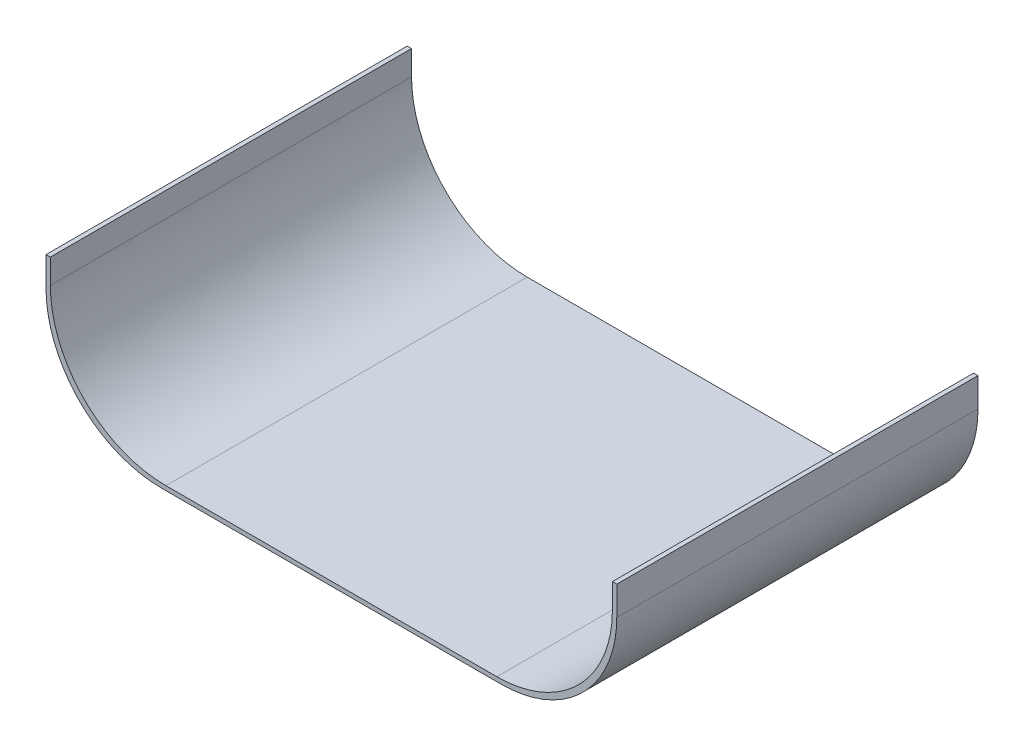
ISO-10303-21;
HEADER;
FILE_DESCRIPTION(('STEP AP214'),'2;1');
FILE_NAME('part.step','',(''),(''),'','','');
FILE_SCHEMA(('AUTOMOTIVE_DESIGN { 1 0 10303 214 1 1 1 1 }'));
ENDSEC;
DATA;
#1=APPLICATION_CONTEXT('core data for automotive mechanical design processes');
#2=APPLICATION_PROTOCOL_DEFINITION('international standard','automotive_design',2000,#1);
#3=PRODUCT_CONTEXT('',#1,'mechanical');
#4=PRODUCT('Part','Part','',(#3));
#5=PRODUCT_RELATED_PRODUCT_CATEGORY('part','',(#4));
#6=PRODUCT_DEFINITION_FORMATION('','',#4);
#7=PRODUCT_DEFINITION_CONTEXT('part definition',#1,'design');
#8=PRODUCT_DEFINITION('design','',#6,#7);
#9=PRODUCT_DEFINITION_SHAPE('','',#8);
#10=(LENGTH_UNIT() NAMED_UNIT(*) SI_UNIT(.MILLI.,.METRE.));
#11=(NAMED_UNIT(*) PLANE_ANGLE_UNIT() SI_UNIT($,.RADIAN.));
#12=(NAMED_UNIT(*) SI_UNIT($,.STERADIAN.) SOLID_ANGLE_UNIT());
#13=UNCERTAINTY_MEASURE_WITH_UNIT(LENGTH_MEASURE(1.E-05),#10,'distance_accuracy_value','');
#14=(GEOMETRIC_REPRESENTATION_CONTEXT(3) GLOBAL_UNCERTAINTY_ASSIGNED_CONTEXT((#13)) GLOBAL_UNIT_ASSIGNED_CONTEXT((#10,
#11,#12)) REPRESENTATION_CONTEXT('',''));
#15=CARTESIAN_POINT('',(0.,0.,0.));
#16=DIRECTION('',(0.,0.,1.));
#17=DIRECTION('',(1.,0.,0.));
#18=AXIS2_PLACEMENT_3D('',#15,#16,#17);
#19=CARTESIAN_POINT('',(83.,-17.,0.));
#20=DIRECTION('',(0.,0.,-1.));
#21=DIRECTION('',(-1.,0.,0.));
#22=AXIS2_PLACEMENT_3D('',#19,#20,#21);
#23=PLANE('',#22);
#24=DIRECTION('',(-1.,0.,0.));
#25=VECTOR('',#24,1.);
#26=CARTESIAN_POINT('',(0.,0.,0.));
#27=LINE('',#26,#25);
#28=CARTESIAN_POINT('',(3.,0.,0.));
#29=VERTEX_POINT('',#28);
#30=CARTESIAN_POINT('',(0.,0.,0.));
#31=VERTEX_POINT('',#30);
#32=EDGE_CURVE('E209',#29,#31,#27,.T.);
#33=ORIENTED_EDGE('',*,*,#32,.T.);
#34=DIRECTION('',(0.,-1.,0.));
#35=VECTOR('',#34,1.);
#36=CARTESIAN_POINT('',(0.,0.,0.));
#37=LINE('',#36,#35);
#38=CARTESIAN_POINT('',(0.,-19.9999999999994,0.));
#39=VERTEX_POINT('',#38);
#40=EDGE_CURVE('E219',#31,#39,#37,.T.);
#41=ORIENTED_EDGE('',*,*,#40,.T.);
#42=CARTESIAN_POINT('',(80.,-20.,0.));
#43=DIRECTION('',(0.,0.,1.));
#44=DIRECTION('',(-1.,0.,0.));
#45=AXIS2_PLACEMENT_3D('',#42,#43,#44);
#46=CIRCLE('',#45,80.);
#47=CARTESIAN_POINT('',(80.0000000000006,-100.,0.));
#48=VERTEX_POINT('',#47);
#49=EDGE_CURVE('E230',#39,#48,#46,.T.);
#50=ORIENTED_EDGE('',*,*,#49,.T.);
#51=DIRECTION('',(1.,0.,0.));
#52=VECTOR('',#51,1.);
#53=CARTESIAN_POINT('',(80.0000000000006,-100.,0.));
#54=LINE('',#53,#52);
#55=CARTESIAN_POINT('',(314.999999999999,-100.,0.));
#56=VERTEX_POINT('',#55);
#57=EDGE_CURVE('E87',#48,#56,#54,.T.);
#58=ORIENTED_EDGE('',*,*,#57,.T.);
#59=CARTESIAN_POINT('',(315.,-20.,0.));
#60=DIRECTION('',(0.,0.,1.));
#61=DIRECTION('',(-1.,0.,0.));
#62=AXIS2_PLACEMENT_3D('',#59,#60,#61);
#63=CIRCLE('',#62,80.);
#64=CARTESIAN_POINT('',(395.,-19.9999999999994,0.));
#65=VERTEX_POINT('',#64);
#66=EDGE_CURVE('E82',#56,#65,#63,.T.);
#67=ORIENTED_EDGE('',*,*,#66,.T.);
#68=DIRECTION('',(0.,1.,0.));
#69=VECTOR('',#68,1.);
#70=CARTESIAN_POINT('',(395.,-19.9999999999994,0.));
#71=LINE('',#70,#69);
#72=CARTESIAN_POINT('',(395.,0.,0.));
#73=VERTEX_POINT('',#72);
#74=EDGE_CURVE('E76',#65,#73,#71,.T.);
#75=ORIENTED_EDGE('',*,*,#74,.T.);
#76=DIRECTION('',(-1.,0.,0.));
#77=VECTOR('',#76,1.);
#78=CARTESIAN_POINT('',(392.,0.,0.));
#79=LINE('',#78,#77);
#80=CARTESIAN_POINT('',(392.,0.,0.));
#81=VERTEX_POINT('',#80);
#82=EDGE_CURVE('E141',#73,#81,#79,.T.);
#83=ORIENTED_EDGE('',*,*,#82,.T.);
#84=DIRECTION('',(0.,-1.,0.));
#85=VECTOR('',#84,1.);
#86=CARTESIAN_POINT('',(392.,-17.,0.));
#87=LINE('',#86,#85);
#88=CARTESIAN_POINT('',(392.,-17.,0.));
#89=VERTEX_POINT('',#88);
#90=EDGE_CURVE('E149',#81,#89,#87,.T.);
#91=ORIENTED_EDGE('',*,*,#90,.T.);
#92=CARTESIAN_POINT('',(312.,-17.,0.));
#93=DIRECTION('',(0.,0.,-1.));
#94=DIRECTION('',(-1.,0.,0.));
#95=AXIS2_PLACEMENT_3D('',#92,#93,#94);
#96=CIRCLE('',#95,80.);
#97=CARTESIAN_POINT('',(312.,-97.,0.));
#98=VERTEX_POINT('',#97);
#99=EDGE_CURVE('E164',#89,#98,#96,.T.);
#100=ORIENTED_EDGE('',*,*,#99,.T.);
#101=DIRECTION('',(-1.,0.,0.));
#102=VECTOR('',#101,1.);
#103=CARTESIAN_POINT('',(83.,-97.,0.));
#104=LINE('',#103,#102);
#105=CARTESIAN_POINT('',(83.,-97.,0.));
#106=VERTEX_POINT('',#105);
#107=EDGE_CURVE('E176',#98,#106,#104,.T.);
#108=ORIENTED_EDGE('',*,*,#107,.T.);
#109=CARTESIAN_POINT('',(83.,-17.,0.));
#110=DIRECTION('',(0.,0.,-1.));
#111=DIRECTION('',(-1.,0.,0.));
#112=AXIS2_PLACEMENT_3D('',#109,#110,#111);
#113=CIRCLE('',#112,80.);
#114=CARTESIAN_POINT('',(3.,-17.,0.));
#115=VERTEX_POINT('',#114);
#116=EDGE_CURVE('E187',#106,#115,#113,.T.);
#117=ORIENTED_EDGE('',*,*,#116,.T.);
#118=DIRECTION('',(0.,1.,0.));
#119=VECTOR('',#118,1.);
#120=CARTESIAN_POINT('',(3.,0.,0.));
#121=LINE('',#120,#119);
#122=EDGE_CURVE('E198',#115,#29,#121,.T.);
#123=ORIENTED_EDGE('',*,*,#122,.T.);
#124=EDGE_LOOP('',(#33,#41,#50,#58,#67,#75,#83,#91,#100,#108,#117,#123));
#125=FACE_BOUND('',#124,.T.);
#126=ADVANCED_FACE('F39',(#125),#23,.F.);
#127=CARTESIAN_POINT('',(82.9999999999999,-17.,-250.));
#128=DIRECTION('',(0.,0.,-1.));
#129=DIRECTION('',(-1.,0.,0.));
#130=AXIS2_PLACEMENT_3D('',#127,#128,#129);
#131=PLANE('',#130);
#132=DIRECTION('',(-1.,0.,0.));
#133=VECTOR('',#132,1.);
#134=CARTESIAN_POINT('',(0.,0.,-250.));
#135=LINE('',#134,#133);
#136=CARTESIAN_POINT('',(2.99999999999992,0.,-250.));
#137=VERTEX_POINT('',#136);
#138=CARTESIAN_POINT('',(0.,0.,-250.));
#139=VERTEX_POINT('',#138);
#140=EDGE_CURVE('E216',#137,#139,#135,.T.);
#141=ORIENTED_EDGE('',*,*,#140,.F.);
#142=DIRECTION('',(0.,1.,0.));
#143=VECTOR('',#142,1.);
#144=CARTESIAN_POINT('',(2.99999999999992,0.,-250.));
#145=LINE('',#144,#143);
#146=CARTESIAN_POINT('',(2.99999999999992,-17.,-250.));
#147=VERTEX_POINT('',#146);
#148=EDGE_CURVE('E205',#147,#137,#145,.T.);
#149=ORIENTED_EDGE('',*,*,#148,.F.);
#150=CARTESIAN_POINT('',(82.9999999999999,-17.,-250.));
#151=DIRECTION('',(0.,0.,-1.));
#152=DIRECTION('',(-1.,0.,0.));
#153=AXIS2_PLACEMENT_3D('',#150,#151,#152);
#154=CIRCLE('',#153,80.);
#155=CARTESIAN_POINT('',(82.9999999999999,-97.,-250.));
#156=VERTEX_POINT('',#155);
#157=EDGE_CURVE('E194',#156,#147,#154,.T.);
#158=ORIENTED_EDGE('',*,*,#157,.F.);
#159=DIRECTION('',(-1.,0.,0.));
#160=VECTOR('',#159,1.);
#161=CARTESIAN_POINT('',(82.9999999999999,-97.,-250.));
#162=LINE('',#161,#160);
#163=CARTESIAN_POINT('',(312.,-97.,-250.));
#164=VERTEX_POINT('',#163);
#165=EDGE_CURVE('E183',#164,#156,#162,.T.);
#166=ORIENTED_EDGE('',*,*,#165,.F.);
#167=CARTESIAN_POINT('',(312.,-17.,-250.));
#168=DIRECTION('',(0.,0.,-1.));
#169=DIRECTION('',(-1.,0.,0.));
#170=AXIS2_PLACEMENT_3D('',#167,#168,#169);
#171=CIRCLE('',#170,80.);
#172=CARTESIAN_POINT('',(392.,-17.,-250.));
#173=VERTEX_POINT('',#172);
#174=EDGE_CURVE('E172',#173,#164,#171,.T.);
#175=ORIENTED_EDGE('',*,*,#174,.F.);
#176=DIRECTION('',(0.,-1.,0.));
#177=VECTOR('',#176,1.);
#178=CARTESIAN_POINT('',(392.,-17.,-250.));
#179=LINE('',#178,#177);
#180=CARTESIAN_POINT('',(392.,0.,-250.));
#181=VERTEX_POINT('',#180);
#182=EDGE_CURVE('E165',#181,#173,#179,.T.);
#183=ORIENTED_EDGE('',*,*,#182,.F.);
#184=DIRECTION('',(-1.,0.,0.));
#185=VECTOR('',#184,1.);
#186=CARTESIAN_POINT('',(392.,0.,-250.));
#187=LINE('',#186,#185);
#188=CARTESIAN_POINT('',(395.,0.,-250.));
#189=VERTEX_POINT('',#188);
#190=EDGE_CURVE('E156',#189,#181,#187,.T.);
#191=ORIENTED_EDGE('',*,*,#190,.F.);
#192=DIRECTION('',(0.,1.,0.));
#193=VECTOR('',#192,1.);
#194=CARTESIAN_POINT('',(395.,-19.9999999999994,-250.));
#195=LINE('',#194,#193);
#196=CARTESIAN_POINT('',(395.,-19.9999999999994,-250.));
#197=VERTEX_POINT('',#196);
#198=EDGE_CURVE('E11',#197,#189,#195,.T.);
#199=ORIENTED_EDGE('',*,*,#198,.F.);
#200=CARTESIAN_POINT('',(315.,-20.,-250.));
#201=DIRECTION('',(0.,0.,1.));
#202=DIRECTION('',(-1.,0.,0.));
#203=AXIS2_PLACEMENT_3D('',#200,#201,#202);
#204=CIRCLE('',#203,80.);
#205=CARTESIAN_POINT('',(314.999999999999,-100.,-250.));
#206=VERTEX_POINT('',#205);
#207=EDGE_CURVE('E54',#206,#197,#204,.T.);
#208=ORIENTED_EDGE('',*,*,#207,.F.);
#209=DIRECTION('',(1.,0.,0.));
#210=VECTOR('',#209,1.);
#211=CARTESIAN_POINT('',(80.0000000000005,-100.,-250.));
#212=LINE('',#211,#210);
#213=CARTESIAN_POINT('',(80.0000000000005,-100.,-250.));
#214=VERTEX_POINT('',#213);
#215=EDGE_CURVE('E63',#214,#206,#212,.T.);
#216=ORIENTED_EDGE('',*,*,#215,.F.);
#217=CARTESIAN_POINT('',(79.9999999999999,-20.,-250.));
#218=DIRECTION('',(0.,0.,1.));
#219=DIRECTION('',(-1.,0.,0.));
#220=AXIS2_PLACEMENT_3D('',#217,#218,#219);
#221=CIRCLE('',#220,80.);
#222=CARTESIAN_POINT('',(0.,-19.9999999999994,-250.));
#223=VERTEX_POINT('',#222);
#224=EDGE_CURVE('E237',#223,#214,#221,.T.);
#225=ORIENTED_EDGE('',*,*,#224,.F.);
#226=DIRECTION('',(0.,-1.,0.));
#227=VECTOR('',#226,1.);
#228=CARTESIAN_POINT('',(0.,0.,-250.));
#229=LINE('',#228,#227);
#230=EDGE_CURVE('E226',#139,#223,#229,.T.);
#231=ORIENTED_EDGE('',*,*,#230,.F.);
#232=EDGE_LOOP('',(#141,#149,#158,#166,#175,#183,#191,#199,#208,#216,#225,#231));
#233=FACE_BOUND('',#232,.T.);
#234=ADVANCED_FACE('F269',(#233),#131,.T.);
#235=CARTESIAN_POINT('',(392.,0.,0.));
#236=DIRECTION('',(0.,-1.,0.));
#237=DIRECTION('',(0.,0.,-1.));
#238=AXIS2_PLACEMENT_3D('',#235,#236,#237);
#239=PLANE('',#238);
#240=DIRECTION('',(0.,0.,-1.));
#241=VECTOR('',#240,1.);
#242=CARTESIAN_POINT('',(392.,0.,0.));
#243=LINE('',#242,#241);
#244=EDGE_CURVE('E145',#81,#181,#243,.T.);
#245=ORIENTED_EDGE('',*,*,#244,.F.);
#246=ORIENTED_EDGE('',*,*,#82,.F.);
#247=DIRECTION('',(0.,0.,-1.));
#248=VECTOR('',#247,1.);
#249=CARTESIAN_POINT('',(395.,0.,0.));
#250=LINE('',#249,#248);
#251=EDGE_CURVE('E143',#73,#189,#250,.T.);
#252=ORIENTED_EDGE('',*,*,#251,.T.);
#253=ORIENTED_EDGE('',*,*,#190,.T.);
#254=EDGE_LOOP('',(#245,#246,#252,#253));
#255=FACE_BOUND('',#254,.T.);
#256=ADVANCED_FACE('F142',(#255),#239,.F.);
#257=CARTESIAN_POINT('',(392.,-17.,0.));
#258=DIRECTION('',(1.,0.,0.));
#259=DIRECTION('',(0.,0.,-1.));
#260=AXIS2_PLACEMENT_3D('',#257,#258,#259);
#261=PLANE('',#260);
#262=DIRECTION('',(0.,0.,-1.));
#263=VECTOR('',#262,1.);
#264=CARTESIAN_POINT('',(392.,-17.,0.));
#265=LINE('',#264,#263);
#266=EDGE_CURVE('E168',#89,#173,#265,.T.);
#267=ORIENTED_EDGE('',*,*,#266,.F.);
#268=ORIENTED_EDGE('',*,*,#90,.F.);
#269=ORIENTED_EDGE('',*,*,#244,.T.);
#270=ORIENTED_EDGE('',*,*,#182,.T.);
#271=EDGE_LOOP('',(#267,#268,#269,#270));
#272=FACE_BOUND('',#271,.T.);
#273=ADVANCED_FACE('F276',(#272),#261,.F.);
#274=CARTESIAN_POINT('',(312.,-17.,0.));
#275=DIRECTION('',(0.,0.,-1.));
#276=DIRECTION('',(-1.,0.,0.));
#277=AXIS2_PLACEMENT_3D('',#274,#275,#276);
#278=CYLINDRICAL_SURFACE('',#277,80.);
#279=DIRECTION('',(0.,0.,-1.));
#280=VECTOR('',#279,1.);
#281=CARTESIAN_POINT('',(312.,-97.,0.));
#282=LINE('',#281,#280);
#283=EDGE_CURVE('E179',#98,#164,#282,.T.);
#284=ORIENTED_EDGE('',*,*,#283,.F.);
#285=ORIENTED_EDGE('',*,*,#99,.F.);
#286=ORIENTED_EDGE('',*,*,#266,.T.);
#287=ORIENTED_EDGE('',*,*,#174,.T.);
#288=EDGE_LOOP('',(#284,#285,#286,#287));
#289=FACE_BOUND('',#288,.T.);
#290=ADVANCED_FACE('F300',(#289),#278,.F.);
#291=CARTESIAN_POINT('',(83.,-97.,0.));
#292=DIRECTION('',(0.,-1.,0.));
#293=DIRECTION('',(1.,0.,0.));
#294=AXIS2_PLACEMENT_3D('',#291,#292,#293);
#295=PLANE('',#294);
#296=DIRECTION('',(0.,0.,-1.));
#297=VECTOR('',#296,1.);
#298=CARTESIAN_POINT('',(83.,-97.,0.));
#299=LINE('',#298,#297);
#300=EDGE_CURVE('E190',#106,#156,#299,.T.);
#301=ORIENTED_EDGE('',*,*,#300,.F.);
#302=ORIENTED_EDGE('',*,*,#107,.F.);
#303=ORIENTED_EDGE('',*,*,#283,.T.);
#304=ORIENTED_EDGE('',*,*,#165,.T.);
#305=EDGE_LOOP('',(#301,#302,#303,#304));
#306=FACE_BOUND('',#305,.T.);
#307=ADVANCED_FACE('F298',(#306),#295,.F.);
#308=CARTESIAN_POINT('',(83.,-17.,0.));
#309=DIRECTION('',(0.,0.,-1.));
#310=DIRECTION('',(-1.,0.,0.));
#311=AXIS2_PLACEMENT_3D('',#308,#309,#310);
#312=CYLINDRICAL_SURFACE('',#311,80.);
#313=DIRECTION('',(0.,0.,-1.));
#314=VECTOR('',#313,1.);
#315=CARTESIAN_POINT('',(3.,-17.,0.));
#316=LINE('',#315,#314);
#317=EDGE_CURVE('E201',#115,#147,#316,.T.);
#318=ORIENTED_EDGE('',*,*,#317,.F.);
#319=ORIENTED_EDGE('',*,*,#116,.F.);
#320=ORIENTED_EDGE('',*,*,#300,.T.);
#321=ORIENTED_EDGE('',*,*,#157,.T.);
#322=EDGE_LOOP('',(#318,#319,#320,#321));
#323=FACE_BOUND('',#322,.T.);
#324=ADVANCED_FACE('F291',(#323),#312,.F.);
#325=CARTESIAN_POINT('',(3.,0.,0.));
#326=DIRECTION('',(-1.,0.,0.));
#327=DIRECTION('',(0.,0.,1.));
#328=AXIS2_PLACEMENT_3D('',#325,#326,#327);
#329=PLANE('',#328);
#330=DIRECTION('',(0.,0.,-1.));
#331=VECTOR('',#330,1.);
#332=CARTESIAN_POINT('',(3.,0.,0.));
#333=LINE('',#332,#331);
#334=EDGE_CURVE('E212',#29,#137,#333,.T.);
#335=ORIENTED_EDGE('',*,*,#334,.F.);
#336=ORIENTED_EDGE('',*,*,#122,.F.);
#337=ORIENTED_EDGE('',*,*,#317,.T.);
#338=ORIENTED_EDGE('',*,*,#148,.T.);
#339=EDGE_LOOP('',(#335,#336,#337,#338));
#340=FACE_BOUND('',#339,.T.);
#341=ADVANCED_FACE('F288',(#340),#329,.F.);
#342=CARTESIAN_POINT('',(0.,0.,0.));
#343=DIRECTION('',(0.,-1.,0.));
#344=DIRECTION('',(0.,0.,-1.));
#345=AXIS2_PLACEMENT_3D('',#342,#343,#344);
#346=PLANE('',#345);
#347=DIRECTION('',(0.,0.,-1.));
#348=VECTOR('',#347,1.);
#349=CARTESIAN_POINT('',(0.,0.,0.));
#350=LINE('',#349,#348);
#351=EDGE_CURVE('E222',#31,#139,#350,.T.);
#352=ORIENTED_EDGE('',*,*,#351,.F.);
#353=ORIENTED_EDGE('',*,*,#32,.F.);
#354=ORIENTED_EDGE('',*,*,#334,.T.);
#355=ORIENTED_EDGE('',*,*,#140,.T.);
#356=EDGE_LOOP('',(#352,#353,#354,#355));
#357=FACE_BOUND('',#356,.T.);
#358=ADVANCED_FACE('F286',(#357),#346,.F.);
#359=CARTESIAN_POINT('',(0.,0.,0.));
#360=DIRECTION('',(1.,0.,0.));
#361=DIRECTION('',(0.,0.,-1.));
#362=AXIS2_PLACEMENT_3D('',#359,#360,#361);
#363=PLANE('',#362);
#364=DIRECTION('',(0.,0.,-1.));
#365=VECTOR('',#364,1.);
#366=CARTESIAN_POINT('',(0.,-19.9999999999994,0.));
#367=LINE('',#366,#365);
#368=EDGE_CURVE('E233',#39,#223,#367,.T.);
#369=ORIENTED_EDGE('',*,*,#368,.F.);
#370=ORIENTED_EDGE('',*,*,#40,.F.);
#371=ORIENTED_EDGE('',*,*,#351,.T.);
#372=ORIENTED_EDGE('',*,*,#230,.T.);
#373=EDGE_LOOP('',(#369,#370,#371,#372));
#374=FACE_BOUND('',#373,.T.);
#375=ADVANCED_FACE('F307',(#374),#363,.F.);
#376=CARTESIAN_POINT('',(80.,-20.,0.));
#377=DIRECTION('',(0.,0.,-1.));
#378=DIRECTION('',(-1.,0.,0.));
#379=AXIS2_PLACEMENT_3D('',#376,#377,#378);
#380=CYLINDRICAL_SURFACE('',#379,80.);
#381=DIRECTION('',(0.,0.,-1.));
#382=VECTOR('',#381,1.);
#383=CARTESIAN_POINT('',(80.0000000000006,-100.,0.));
#384=LINE('',#383,#382);
#385=EDGE_CURVE('E242',#48,#214,#384,.T.);
#386=ORIENTED_EDGE('',*,*,#385,.F.);
#387=ORIENTED_EDGE('',*,*,#49,.F.);
#388=ORIENTED_EDGE('',*,*,#368,.T.);
#389=ORIENTED_EDGE('',*,*,#224,.T.);
#390=EDGE_LOOP('',(#386,#387,#388,#389));
#391=FACE_BOUND('',#390,.T.);
#392=ADVANCED_FACE('F266',(#391),#380,.T.);
#393=CARTESIAN_POINT('',(80.0000000000006,-100.,0.));
#394=DIRECTION('',(0.,1.,0.));
#395=DIRECTION('',(0.,0.,1.));
#396=AXIS2_PLACEMENT_3D('',#393,#394,#395);
#397=PLANE('',#396);
#398=DIRECTION('',(0.,0.,-1.));
#399=VECTOR('',#398,1.);
#400=CARTESIAN_POINT('',(314.999999999999,-100.,0.));
#401=LINE('',#400,#399);
#402=EDGE_CURVE('E249',#56,#206,#401,.T.);
#403=ORIENTED_EDGE('',*,*,#402,.F.);
#404=ORIENTED_EDGE('',*,*,#57,.F.);
#405=ORIENTED_EDGE('',*,*,#385,.T.);
#406=ORIENTED_EDGE('',*,*,#215,.T.);
#407=EDGE_LOOP('',(#403,#404,#405,#406));
#408=FACE_BOUND('',#407,.T.);
#409=ADVANCED_FACE('F259',(#408),#397,.F.);
#410=CARTESIAN_POINT('',(315.,-20.,0.));
#411=DIRECTION('',(0.,0.,-1.));
#412=DIRECTION('',(-1.,0.,0.));
#413=AXIS2_PLACEMENT_3D('',#410,#411,#412);
#414=CYLINDRICAL_SURFACE('',#413,80.);
#415=DIRECTION('',(0.,0.,-1.));
#416=VECTOR('',#415,1.);
#417=CARTESIAN_POINT('',(395.,-19.9999999999994,0.));
#418=LINE('',#417,#416);
#419=EDGE_CURVE('E47',#65,#197,#418,.T.);
#420=ORIENTED_EDGE('',*,*,#419,.F.);
#421=ORIENTED_EDGE('',*,*,#66,.F.);
#422=ORIENTED_EDGE('',*,*,#402,.T.);
#423=ORIENTED_EDGE('',*,*,#207,.T.);
#424=EDGE_LOOP('',(#420,#421,#422,#423));
#425=FACE_BOUND('',#424,.T.);
#426=ADVANCED_FACE('F257',(#425),#414,.T.);
#427=CARTESIAN_POINT('',(395.,-19.9999999999994,0.));
#428=DIRECTION('',(-1.,0.,0.));
#429=DIRECTION('',(0.,0.,1.));
#430=AXIS2_PLACEMENT_3D('',#427,#428,#429);
#431=PLANE('',#430);
#432=ORIENTED_EDGE('',*,*,#198,.T.);
#433=ORIENTED_EDGE('',*,*,#251,.F.);
#434=ORIENTED_EDGE('',*,*,#74,.F.);
#435=ORIENTED_EDGE('',*,*,#419,.T.);
#436=EDGE_LOOP('',(#432,#433,#434,#435));
#437=FACE_BOUND('',#436,.T.);
#438=ADVANCED_FACE('F153',(#437),#431,.F.);
#439=CLOSED_SHELL('',(#126,#234,#256,#273,#290,#307,#324,#341,#358,#375,#392,#409,#426,#438));
#440=MANIFOLD_SOLID_BREP('B2',#439);
#441=ADVANCED_BREP_SHAPE_REPRESENTATION('',(#18,#440),#14);
#442=SHAPE_DEFINITION_REPRESENTATION(#9,#441);
ENDSEC;
END-ISO-10303-21;
